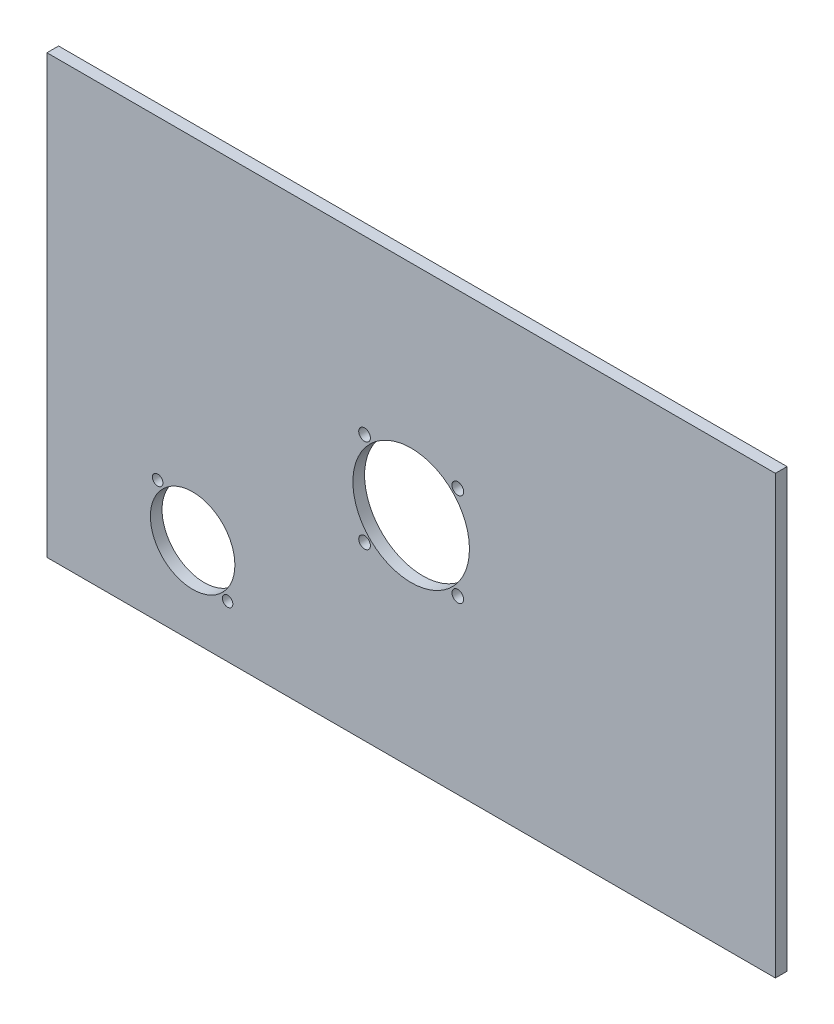
ISO-10303-21;
HEADER;
FILE_DESCRIPTION(('STEP AP214'),'2;1');
FILE_NAME('part.step','',(''),(''),'','','');
FILE_SCHEMA(('AUTOMOTIVE_DESIGN { 1 0 10303 214 1 1 1 1 }'));
ENDSEC;
DATA;
#1=APPLICATION_CONTEXT('core data for automotive mechanical design processes');
#2=APPLICATION_PROTOCOL_DEFINITION('international standard','automotive_design',2000,#1);
#3=PRODUCT_CONTEXT('',#1,'mechanical');
#4=PRODUCT('Part','Part','',(#3));
#5=PRODUCT_RELATED_PRODUCT_CATEGORY('part','',(#4));
#6=PRODUCT_DEFINITION_FORMATION('','',#4);
#7=PRODUCT_DEFINITION_CONTEXT('part definition',#1,'design');
#8=PRODUCT_DEFINITION('design','',#6,#7);
#9=PRODUCT_DEFINITION_SHAPE('','',#8);
#10=(LENGTH_UNIT() NAMED_UNIT(*) SI_UNIT(.MILLI.,.METRE.));
#11=(NAMED_UNIT(*) PLANE_ANGLE_UNIT() SI_UNIT($,.RADIAN.));
#12=(NAMED_UNIT(*) SI_UNIT($,.STERADIAN.) SOLID_ANGLE_UNIT());
#13=UNCERTAINTY_MEASURE_WITH_UNIT(LENGTH_MEASURE(1.E-05),#10,'distance_accuracy_value','');
#14=(GEOMETRIC_REPRESENTATION_CONTEXT(3) GLOBAL_UNCERTAINTY_ASSIGNED_CONTEXT((#13)) GLOBAL_UNIT_ASSIGNED_CONTEXT((#10,
#11,#12)) REPRESENTATION_CONTEXT('',''));
#15=CARTESIAN_POINT('',(0.,0.,0.));
#16=DIRECTION('',(0.,0.,1.));
#17=DIRECTION('',(1.,0.,0.));
#18=AXIS2_PLACEMENT_3D('',#15,#16,#17);
#19=CARTESIAN_POINT('',(-112.824675324675,64.3668831168831,4.));
#20=DIRECTION('',(1.,0.,0.));
#21=DIRECTION('',(0.,1.,0.));
#22=AXIS2_PLACEMENT_3D('',#19,#20,#21);
#23=PLANE('',#22);
#24=DIRECTION('',(0.,-1.,0.));
#25=VECTOR('',#24,1.);
#26=CARTESIAN_POINT('',(-112.824675324675,64.3668831168831,0.));
#27=LINE('',#26,#25);
#28=CARTESIAN_POINT('',(-112.824675324675,64.3668831168831,0.));
#29=VERTEX_POINT('',#28);
#30=CARTESIAN_POINT('',(-112.824675324675,-85.6331168831169,0.));
#31=VERTEX_POINT('',#30);
#32=EDGE_CURVE('E96',#29,#31,#27,.T.);
#33=ORIENTED_EDGE('',*,*,#32,.T.);
#34=DIRECTION('',(0.,0.,-1.));
#35=VECTOR('',#34,1.);
#36=CARTESIAN_POINT('',(-112.824675324675,-85.6331168831169,4.));
#37=LINE('',#36,#35);
#38=CARTESIAN_POINT('',(-112.824675324675,-85.6331168831169,4.));
#39=VERTEX_POINT('',#38);
#40=EDGE_CURVE('E11',#39,#31,#37,.T.);
#41=ORIENTED_EDGE('',*,*,#40,.F.);
#42=DIRECTION('',(0.,-1.,0.));
#43=VECTOR('',#42,1.);
#44=CARTESIAN_POINT('',(-112.824675324675,64.3668831168831,4.));
#45=LINE('',#44,#43);
#46=CARTESIAN_POINT('',(-112.824675324675,64.3668831168831,4.));
#47=VERTEX_POINT('',#46);
#48=EDGE_CURVE('E84',#47,#39,#45,.T.);
#49=ORIENTED_EDGE('',*,*,#48,.F.);
#50=DIRECTION('',(0.,0.,-1.));
#51=VECTOR('',#50,1.);
#52=CARTESIAN_POINT('',(-112.824675324675,64.3668831168831,4.));
#53=LINE('',#52,#51);
#54=EDGE_CURVE('E92',#47,#29,#53,.T.);
#55=ORIENTED_EDGE('',*,*,#54,.T.);
#56=EDGE_LOOP('',(#33,#41,#49,#55));
#57=FACE_BOUND('',#56,.T.);
#58=ADVANCED_FACE('F33',(#57),#23,.F.);
#59=CARTESIAN_POINT('',(-112.824675324675,-85.6331168831169,4.));
#60=DIRECTION('',(0.,1.,0.));
#61=DIRECTION('',(0.,0.,1.));
#62=AXIS2_PLACEMENT_3D('',#59,#60,#61);
#63=PLANE('',#62);
#64=DIRECTION('',(1.,0.,0.));
#65=VECTOR('',#64,1.);
#66=CARTESIAN_POINT('',(-112.824675324675,-85.6331168831169,0.));
#67=LINE('',#66,#65);
#68=CARTESIAN_POINT('',(137.175324675325,-85.6331168831169,0.));
#69=VERTEX_POINT('',#68);
#70=EDGE_CURVE('E88',#31,#69,#67,.T.);
#71=ORIENTED_EDGE('',*,*,#70,.T.);
#72=DIRECTION('',(0.,0.,-1.));
#73=VECTOR('',#72,1.);
#74=CARTESIAN_POINT('',(137.175324675325,-85.6331168831169,4.));
#75=LINE('',#74,#73);
#76=CARTESIAN_POINT('',(137.175324675325,-85.6331168831169,4.));
#77=VERTEX_POINT('',#76);
#78=EDGE_CURVE('E41',#77,#69,#75,.T.);
#79=ORIENTED_EDGE('',*,*,#78,.F.);
#80=DIRECTION('',(1.,0.,0.));
#81=VECTOR('',#80,1.);
#82=CARTESIAN_POINT('',(-112.824675324675,-85.6331168831169,4.));
#83=LINE('',#82,#81);
#84=EDGE_CURVE('E79',#39,#77,#83,.T.);
#85=ORIENTED_EDGE('',*,*,#84,.F.);
#86=ORIENTED_EDGE('',*,*,#40,.T.);
#87=EDGE_LOOP('',(#71,#79,#85,#86));
#88=FACE_BOUND('',#87,.T.);
#89=ADVANCED_FACE('F87',(#88),#63,.F.);
#90=CARTESIAN_POINT('',(137.175324675325,64.3668831168831,4.));
#91=DIRECTION('',(-1.,0.,0.));
#92=DIRECTION('',(0.,0.,1.));
#93=AXIS2_PLACEMENT_3D('',#90,#91,#92);
#94=PLANE('',#93);
#95=DIRECTION('',(0.,1.,0.));
#96=VECTOR('',#95,1.);
#97=CARTESIAN_POINT('',(137.175324675325,64.3668831168831,0.));
#98=LINE('',#97,#96);
#99=CARTESIAN_POINT('',(137.175324675325,64.3668831168831,0.));
#100=VERTEX_POINT('',#99);
#101=EDGE_CURVE('E66',#69,#100,#98,.T.);
#102=ORIENTED_EDGE('',*,*,#101,.T.);
#103=DIRECTION('',(0.,0.,-1.));
#104=VECTOR('',#103,1.);
#105=CARTESIAN_POINT('',(137.175324675325,64.3668831168831,4.));
#106=LINE('',#105,#104);
#107=CARTESIAN_POINT('',(137.175324675325,64.3668831168831,4.));
#108=VERTEX_POINT('',#107);
#109=EDGE_CURVE('E89',#108,#100,#106,.T.);
#110=ORIENTED_EDGE('',*,*,#109,.F.);
#111=DIRECTION('',(0.,1.,0.));
#112=VECTOR('',#111,1.);
#113=CARTESIAN_POINT('',(137.175324675325,64.3668831168831,4.));
#114=LINE('',#113,#112);
#115=EDGE_CURVE('E82',#77,#108,#114,.T.);
#116=ORIENTED_EDGE('',*,*,#115,.F.);
#117=ORIENTED_EDGE('',*,*,#78,.T.);
#118=EDGE_LOOP('',(#102,#110,#116,#117));
#119=FACE_BOUND('',#118,.T.);
#120=ADVANCED_FACE('F90',(#119),#94,.F.);
#121=CARTESIAN_POINT('',(-112.824675324675,64.3668831168831,4.));
#122=DIRECTION('',(0.,-1.,0.));
#123=DIRECTION('',(0.,0.,-1.));
#124=AXIS2_PLACEMENT_3D('',#121,#122,#123);
#125=PLANE('',#124);
#126=DIRECTION('',(-1.,0.,0.));
#127=VECTOR('',#126,1.);
#128=CARTESIAN_POINT('',(-112.824675324675,64.3668831168831,0.));
#129=LINE('',#128,#127);
#130=EDGE_CURVE('E72',#100,#29,#129,.T.);
#131=ORIENTED_EDGE('',*,*,#130,.T.);
#132=ORIENTED_EDGE('',*,*,#54,.F.);
#133=DIRECTION('',(-1.,0.,0.));
#134=VECTOR('',#133,1.);
#135=CARTESIAN_POINT('',(-112.824675324675,64.3668831168831,4.));
#136=LINE('',#135,#134);
#137=EDGE_CURVE('E49',#108,#47,#136,.T.);
#138=ORIENTED_EDGE('',*,*,#137,.F.);
#139=ORIENTED_EDGE('',*,*,#109,.T.);
#140=EDGE_LOOP('',(#131,#132,#138,#139));
#141=FACE_BOUND('',#140,.T.);
#142=ADVANCED_FACE('F104',(#141),#125,.F.);
#143=CARTESIAN_POINT('',(0.,0.,4.));
#144=DIRECTION('',(0.,0.,1.));
#145=DIRECTION('',(1.,0.,0.));
#146=AXIS2_PLACEMENT_3D('',#143,#144,#145);
#147=PLANE('',#146);
#148=CARTESIAN_POINT('',(-50.8246753246753,-67.6331168831169,4.));
#149=DIRECTION('',(0.,0.,1.));
#150=DIRECTION('',(1.,0.,0.));
#151=AXIS2_PLACEMENT_3D('',#148,#149,#150);
#152=CIRCLE('',#151,1.8);
#153=CARTESIAN_POINT('',(-49.0246753246753,-67.6331168831169,4.));
#154=VERTEX_POINT('',#153);
#155=EDGE_CURVE('E146',#154,#154,#152,.T.);
#156=ORIENTED_EDGE('',*,*,#155,.F.);
#157=EDGE_LOOP('',(#156));
#158=FACE_BOUND('',#157,.T.);
#159=CARTESIAN_POINT('',(-74.8246753246754,-43.6331168831169,4.));
#160=DIRECTION('',(0.,0.,1.));
#161=DIRECTION('',(1.,0.,0.));
#162=AXIS2_PLACEMENT_3D('',#159,#160,#161);
#163=CIRCLE('',#162,1.79999999999999);
#164=CARTESIAN_POINT('',(-73.0246753246754,-43.6331168831169,4.));
#165=VERTEX_POINT('',#164);
#166=EDGE_CURVE('E152',#165,#165,#163,.T.);
#167=ORIENTED_EDGE('',*,*,#166,.F.);
#168=EDGE_LOOP('',(#167));
#169=FACE_BOUND('',#168,.T.);
#170=CARTESIAN_POINT('',(-62.8246753246754,-55.6331168831169,4.));
#171=DIRECTION('',(0.,0.,1.));
#172=DIRECTION('',(1.,0.,0.));
#173=AXIS2_PLACEMENT_3D('',#170,#171,#172);
#174=CIRCLE('',#173,14.5);
#175=CARTESIAN_POINT('',(-48.3246753246754,-55.6331168831169,4.));
#176=VERTEX_POINT('',#175);
#177=EDGE_CURVE('E140',#176,#176,#174,.T.);
#178=ORIENTED_EDGE('',*,*,#177,.F.);
#179=EDGE_LOOP('',(#178));
#180=FACE_BOUND('',#179,.T.);
#181=CARTESIAN_POINT('',(-3.82467532467505,-26.6331168831167,4.));
#182=DIRECTION('',(0.,0.,1.));
#183=DIRECTION('',(1.,0.,0.));
#184=AXIS2_PLACEMENT_3D('',#181,#182,#183);
#185=CIRCLE('',#184,2.);
#186=CARTESIAN_POINT('',(-1.82467532467505,-26.6331168831167,4.));
#187=VERTEX_POINT('',#186);
#188=EDGE_CURVE('E122',#187,#187,#185,.T.);
#189=ORIENTED_EDGE('',*,*,#188,.F.);
#190=EDGE_LOOP('',(#189));
#191=FACE_BOUND('',#190,.T.);
#192=CARTESIAN_POINT('',(28.175324675325,-26.6331168831165,4.));
#193=DIRECTION('',(0.,0.,1.));
#194=DIRECTION('',(1.,0.,0.));
#195=AXIS2_PLACEMENT_3D('',#192,#193,#194);
#196=CIRCLE('',#195,2.);
#197=CARTESIAN_POINT('',(30.175324675325,-26.6331168831165,4.));
#198=VERTEX_POINT('',#197);
#199=EDGE_CURVE('E129',#198,#198,#196,.T.);
#200=ORIENTED_EDGE('',*,*,#199,.F.);
#201=EDGE_LOOP('',(#200));
#202=FACE_BOUND('',#201,.T.);
#203=CARTESIAN_POINT('',(28.1753246753247,5.36688311688351,4.));
#204=DIRECTION('',(0.,0.,1.));
#205=DIRECTION('',(1.,0.,0.));
#206=AXIS2_PLACEMENT_3D('',#203,#204,#205);
#207=CIRCLE('',#206,2.);
#208=CARTESIAN_POINT('',(30.1753246753247,5.36688311688351,4.));
#209=VERTEX_POINT('',#208);
#210=EDGE_CURVE('E135',#209,#209,#207,.T.);
#211=ORIENTED_EDGE('',*,*,#210,.F.);
#212=EDGE_LOOP('',(#211));
#213=FACE_BOUND('',#212,.T.);
#214=CARTESIAN_POINT('',(-3.82467532467533,5.36688311688312,4.));
#215=DIRECTION('',(0.,0.,1.));
#216=DIRECTION('',(1.,0.,0.));
#217=AXIS2_PLACEMENT_3D('',#214,#215,#216);
#218=CIRCLE('',#217,2.);
#219=CARTESIAN_POINT('',(-1.82467532467534,5.36688311688312,4.));
#220=VERTEX_POINT('',#219);
#221=EDGE_CURVE('E116',#220,#220,#218,.T.);
#222=ORIENTED_EDGE('',*,*,#221,.F.);
#223=EDGE_LOOP('',(#222));
#224=FACE_BOUND('',#223,.T.);
#225=CARTESIAN_POINT('',(12.1753246753247,-10.6331168831169,4.));
#226=DIRECTION('',(0.,0.,1.));
#227=DIRECTION('',(1.,0.,0.));
#228=AXIS2_PLACEMENT_3D('',#225,#226,#227);
#229=CIRCLE('',#228,20.);
#230=CARTESIAN_POINT('',(32.1753246753247,-10.6331168831169,4.));
#231=VERTEX_POINT('',#230);
#232=EDGE_CURVE('E110',#231,#231,#229,.T.);
#233=ORIENTED_EDGE('',*,*,#232,.F.);
#234=EDGE_LOOP('',(#233));
#235=FACE_BOUND('',#234,.T.);
#236=ORIENTED_EDGE('',*,*,#48,.T.);
#237=ORIENTED_EDGE('',*,*,#84,.T.);
#238=ORIENTED_EDGE('',*,*,#115,.T.);
#239=ORIENTED_EDGE('',*,*,#137,.T.);
#240=EDGE_LOOP('',(#236,#237,#238,#239));
#241=FACE_BOUND('',#240,.T.);
#242=ADVANCED_FACE('F80',(#158,#169,#180,#191,#202,#213,#224,#235,#241),#147,.T.);
#243=CARTESIAN_POINT('',(0.,0.,0.));
#244=DIRECTION('',(0.,0.,1.));
#245=DIRECTION('',(1.,0.,0.));
#246=AXIS2_PLACEMENT_3D('',#243,#244,#245);
#247=PLANE('',#246);
#248=CARTESIAN_POINT('',(-50.8246753246753,-67.6331168831169,0.));
#249=DIRECTION('',(0.,0.,1.));
#250=DIRECTION('',(1.,0.,0.));
#251=AXIS2_PLACEMENT_3D('',#248,#249,#250);
#252=CIRCLE('',#251,1.8);
#253=CARTESIAN_POINT('',(-49.0246753246753,-67.6331168831169,0.));
#254=VERTEX_POINT('',#253);
#255=EDGE_CURVE('E149',#254,#254,#252,.T.);
#256=ORIENTED_EDGE('',*,*,#255,.T.);
#257=EDGE_LOOP('',(#256));
#258=FACE_BOUND('',#257,.T.);
#259=CARTESIAN_POINT('',(-74.8246753246754,-43.6331168831169,0.));
#260=DIRECTION('',(0.,0.,1.));
#261=DIRECTION('',(1.,0.,0.));
#262=AXIS2_PLACEMENT_3D('',#259,#260,#261);
#263=CIRCLE('',#262,1.79999999999999);
#264=CARTESIAN_POINT('',(-73.0246753246754,-43.6331168831169,0.));
#265=VERTEX_POINT('',#264);
#266=EDGE_CURVE('E143',#265,#265,#263,.T.);
#267=ORIENTED_EDGE('',*,*,#266,.T.);
#268=EDGE_LOOP('',(#267));
#269=FACE_BOUND('',#268,.T.);
#270=CARTESIAN_POINT('',(-62.8246753246754,-55.6331168831169,0.));
#271=DIRECTION('',(0.,0.,1.));
#272=DIRECTION('',(1.,0.,0.));
#273=AXIS2_PLACEMENT_3D('',#270,#271,#272);
#274=CIRCLE('',#273,14.5);
#275=CARTESIAN_POINT('',(-48.3246753246754,-55.6331168831169,0.));
#276=VERTEX_POINT('',#275);
#277=EDGE_CURVE('E126',#276,#276,#274,.T.);
#278=ORIENTED_EDGE('',*,*,#277,.T.);
#279=EDGE_LOOP('',(#278));
#280=FACE_BOUND('',#279,.T.);
#281=CARTESIAN_POINT('',(-3.82467532467505,-26.6331168831167,0.));
#282=DIRECTION('',(0.,0.,1.));
#283=DIRECTION('',(1.,0.,0.));
#284=AXIS2_PLACEMENT_3D('',#281,#282,#283);
#285=CIRCLE('',#284,2.);
#286=CARTESIAN_POINT('',(-1.82467532467505,-26.6331168831167,0.));
#287=VERTEX_POINT('',#286);
#288=EDGE_CURVE('E125',#287,#287,#285,.T.);
#289=ORIENTED_EDGE('',*,*,#288,.T.);
#290=EDGE_LOOP('',(#289));
#291=FACE_BOUND('',#290,.T.);
#292=CARTESIAN_POINT('',(28.175324675325,-26.6331168831165,0.));
#293=DIRECTION('',(0.,0.,1.));
#294=DIRECTION('',(1.,0.,0.));
#295=AXIS2_PLACEMENT_3D('',#292,#293,#294);
#296=CIRCLE('',#295,2.);
#297=CARTESIAN_POINT('',(30.175324675325,-26.6331168831165,0.));
#298=VERTEX_POINT('',#297);
#299=EDGE_CURVE('E132',#298,#298,#296,.T.);
#300=ORIENTED_EDGE('',*,*,#299,.T.);
#301=EDGE_LOOP('',(#300));
#302=FACE_BOUND('',#301,.T.);
#303=CARTESIAN_POINT('',(28.1753246753247,5.36688311688351,0.));
#304=DIRECTION('',(0.,0.,1.));
#305=DIRECTION('',(1.,0.,0.));
#306=AXIS2_PLACEMENT_3D('',#303,#304,#305);
#307=CIRCLE('',#306,2.);
#308=CARTESIAN_POINT('',(30.1753246753247,5.36688311688351,0.));
#309=VERTEX_POINT('',#308);
#310=EDGE_CURVE('E119',#309,#309,#307,.T.);
#311=ORIENTED_EDGE('',*,*,#310,.T.);
#312=EDGE_LOOP('',(#311));
#313=FACE_BOUND('',#312,.T.);
#314=CARTESIAN_POINT('',(-3.82467532467533,5.36688311688312,0.));
#315=DIRECTION('',(0.,0.,1.));
#316=DIRECTION('',(1.,0.,0.));
#317=AXIS2_PLACEMENT_3D('',#314,#315,#316);
#318=CIRCLE('',#317,2.);
#319=CARTESIAN_POINT('',(-1.82467532467534,5.36688311688312,0.));
#320=VERTEX_POINT('',#319);
#321=EDGE_CURVE('E113',#320,#320,#318,.T.);
#322=ORIENTED_EDGE('',*,*,#321,.T.);
#323=EDGE_LOOP('',(#322));
#324=FACE_BOUND('',#323,.T.);
#325=CARTESIAN_POINT('',(12.1753246753247,-10.6331168831169,0.));
#326=DIRECTION('',(0.,0.,1.));
#327=DIRECTION('',(1.,0.,0.));
#328=AXIS2_PLACEMENT_3D('',#325,#326,#327);
#329=CIRCLE('',#328,20.);
#330=CARTESIAN_POINT('',(32.1753246753247,-10.6331168831169,0.));
#331=VERTEX_POINT('',#330);
#332=EDGE_CURVE('E99',#331,#331,#329,.T.);
#333=ORIENTED_EDGE('',*,*,#332,.T.);
#334=EDGE_LOOP('',(#333));
#335=FACE_BOUND('',#334,.T.);
#336=ORIENTED_EDGE('',*,*,#32,.F.);
#337=ORIENTED_EDGE('',*,*,#130,.F.);
#338=ORIENTED_EDGE('',*,*,#101,.F.);
#339=ORIENTED_EDGE('',*,*,#70,.F.);
#340=EDGE_LOOP('',(#336,#337,#338,#339));
#341=FACE_BOUND('',#340,.T.);
#342=ADVANCED_FACE('F107',(#258,#269,#280,#291,#302,#313,#324,#335,#341),#247,.F.);
#343=CARTESIAN_POINT('',(12.1753246753247,-10.6331168831169,0.));
#344=DIRECTION('',(0.,0.,1.));
#345=DIRECTION('',(1.,0.,0.));
#346=AXIS2_PLACEMENT_3D('',#343,#344,#345);
#347=CYLINDRICAL_SURFACE('',#346,20.);
#348=ORIENTED_EDGE('',*,*,#332,.F.);
#349=EDGE_LOOP('',(#348));
#350=FACE_BOUND('',#349,.T.);
#351=ORIENTED_EDGE('',*,*,#232,.T.);
#352=EDGE_LOOP('',(#351));
#353=FACE_BOUND('',#352,.T.);
#354=ADVANCED_FACE('F184',(#350,#353),#347,.F.);
#355=CARTESIAN_POINT('',(-3.82467532467533,5.36688311688312,0.));
#356=DIRECTION('',(0.,0.,1.));
#357=DIRECTION('',(1.,0.,0.));
#358=AXIS2_PLACEMENT_3D('',#355,#356,#357);
#359=CYLINDRICAL_SURFACE('',#358,2.);
#360=ORIENTED_EDGE('',*,*,#321,.F.);
#361=EDGE_LOOP('',(#360));
#362=FACE_BOUND('',#361,.T.);
#363=ORIENTED_EDGE('',*,*,#221,.T.);
#364=EDGE_LOOP('',(#363));
#365=FACE_BOUND('',#364,.T.);
#366=ADVANCED_FACE('F186',(#362,#365),#359,.F.);
#367=CARTESIAN_POINT('',(28.1753246753247,5.36688311688351,0.));
#368=DIRECTION('',(0.,0.,1.));
#369=DIRECTION('',(1.,0.,0.));
#370=AXIS2_PLACEMENT_3D('',#367,#368,#369);
#371=CYLINDRICAL_SURFACE('',#370,2.);
#372=ORIENTED_EDGE('',*,*,#310,.F.);
#373=EDGE_LOOP('',(#372));
#374=FACE_BOUND('',#373,.T.);
#375=ORIENTED_EDGE('',*,*,#210,.T.);
#376=EDGE_LOOP('',(#375));
#377=FACE_BOUND('',#376,.T.);
#378=ADVANCED_FACE('F193',(#374,#377),#371,.F.);
#379=CARTESIAN_POINT('',(28.175324675325,-26.6331168831165,0.));
#380=DIRECTION('',(0.,0.,1.));
#381=DIRECTION('',(1.,0.,0.));
#382=AXIS2_PLACEMENT_3D('',#379,#380,#381);
#383=CYLINDRICAL_SURFACE('',#382,2.);
#384=ORIENTED_EDGE('',*,*,#299,.F.);
#385=EDGE_LOOP('',(#384));
#386=FACE_BOUND('',#385,.T.);
#387=ORIENTED_EDGE('',*,*,#199,.T.);
#388=EDGE_LOOP('',(#387));
#389=FACE_BOUND('',#388,.T.);
#390=ADVANCED_FACE('F259',(#386,#389),#383,.F.);
#391=CARTESIAN_POINT('',(-3.82467532467505,-26.6331168831167,0.));
#392=DIRECTION('',(0.,0.,1.));
#393=DIRECTION('',(1.,0.,0.));
#394=AXIS2_PLACEMENT_3D('',#391,#392,#393);
#395=CYLINDRICAL_SURFACE('',#394,2.);
#396=ORIENTED_EDGE('',*,*,#288,.F.);
#397=EDGE_LOOP('',(#396));
#398=FACE_BOUND('',#397,.T.);
#399=ORIENTED_EDGE('',*,*,#188,.T.);
#400=EDGE_LOOP('',(#399));
#401=FACE_BOUND('',#400,.T.);
#402=ADVANCED_FACE('F232',(#398,#401),#395,.F.);
#403=CARTESIAN_POINT('',(-62.8246753246754,-55.6331168831169,0.));
#404=DIRECTION('',(0.,0.,1.));
#405=DIRECTION('',(1.,0.,0.));
#406=AXIS2_PLACEMENT_3D('',#403,#404,#405);
#407=CYLINDRICAL_SURFACE('',#406,14.5);
#408=ORIENTED_EDGE('',*,*,#277,.F.);
#409=EDGE_LOOP('',(#408));
#410=FACE_BOUND('',#409,.T.);
#411=ORIENTED_EDGE('',*,*,#177,.T.);
#412=EDGE_LOOP('',(#411));
#413=FACE_BOUND('',#412,.T.);
#414=ADVANCED_FACE('F164',(#410,#413),#407,.F.);
#415=CARTESIAN_POINT('',(-74.8246753246754,-43.6331168831169,0.));
#416=DIRECTION('',(0.,0.,1.));
#417=DIRECTION('',(1.,0.,0.));
#418=AXIS2_PLACEMENT_3D('',#415,#416,#417);
#419=CYLINDRICAL_SURFACE('',#418,1.79999999999999);
#420=ORIENTED_EDGE('',*,*,#266,.F.);
#421=EDGE_LOOP('',(#420));
#422=FACE_BOUND('',#421,.T.);
#423=ORIENTED_EDGE('',*,*,#166,.T.);
#424=EDGE_LOOP('',(#423));
#425=FACE_BOUND('',#424,.T.);
#426=ADVANCED_FACE('F160',(#422,#425),#419,.F.);
#427=CARTESIAN_POINT('',(-50.8246753246753,-67.6331168831169,0.));
#428=DIRECTION('',(0.,0.,1.));
#429=DIRECTION('',(1.,0.,0.));
#430=AXIS2_PLACEMENT_3D('',#427,#428,#429);
#431=CYLINDRICAL_SURFACE('',#430,1.8);
#432=ORIENTED_EDGE('',*,*,#255,.F.);
#433=EDGE_LOOP('',(#432));
#434=FACE_BOUND('',#433,.T.);
#435=ORIENTED_EDGE('',*,*,#155,.T.);
#436=EDGE_LOOP('',(#435));
#437=FACE_BOUND('',#436,.T.);
#438=ADVANCED_FACE('F163',(#434,#437),#431,.F.);
#439=CLOSED_SHELL('',(#58,#89,#120,#142,#242,#342,#354,#366,#378,#390,#402,#414,#426,#438));
#440=MANIFOLD_SOLID_BREP('B2',#439);
#441=ADVANCED_BREP_SHAPE_REPRESENTATION('',(#18,#440),#14);
#442=SHAPE_DEFINITION_REPRESENTATION(#9,#441);
ENDSEC;
END-ISO-10303-21;
